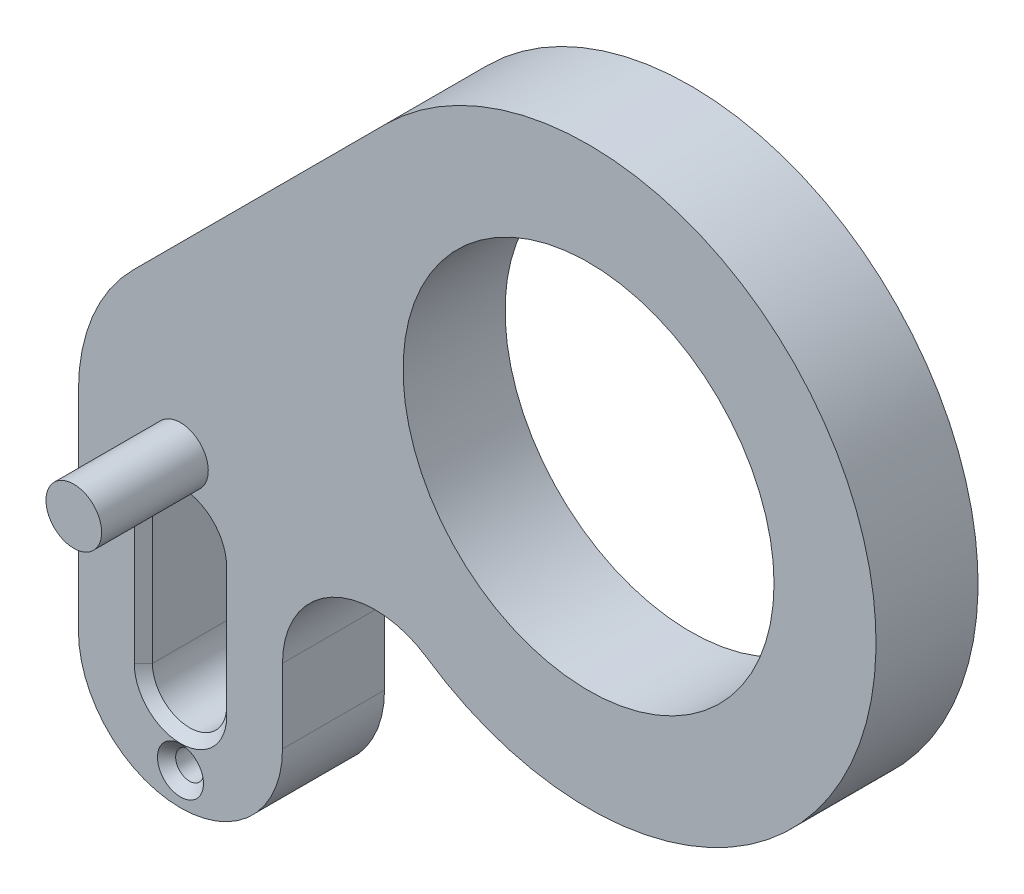
ISO-10303-21;
HEADER;
FILE_DESCRIPTION(('STEP AP214'),'2;1');
FILE_NAME('part.step','',(''),(''),'','','');
FILE_SCHEMA(('AUTOMOTIVE_DESIGN { 1 0 10303 214 1 1 1 1 }'));
ENDSEC;
DATA;
#1=APPLICATION_CONTEXT('core data for automotive mechanical design processes');
#2=APPLICATION_PROTOCOL_DEFINITION('international standard','automotive_design',2000,#1);
#3=PRODUCT_CONTEXT('',#1,'mechanical');
#4=PRODUCT('Part','Part','',(#3));
#5=PRODUCT_RELATED_PRODUCT_CATEGORY('part','',(#4));
#6=PRODUCT_DEFINITION_FORMATION('','',#4);
#7=PRODUCT_DEFINITION_CONTEXT('part definition',#1,'design');
#8=PRODUCT_DEFINITION('design','',#6,#7);
#9=PRODUCT_DEFINITION_SHAPE('','',#8);
#10=(LENGTH_UNIT() NAMED_UNIT(*) SI_UNIT(.MILLI.,.METRE.));
#11=(NAMED_UNIT(*) PLANE_ANGLE_UNIT() SI_UNIT($,.RADIAN.));
#12=(NAMED_UNIT(*) SI_UNIT($,.STERADIAN.) SOLID_ANGLE_UNIT());
#13=UNCERTAINTY_MEASURE_WITH_UNIT(LENGTH_MEASURE(1.E-05),#10,'distance_accuracy_value','');
#14=(GEOMETRIC_REPRESENTATION_CONTEXT(3) GLOBAL_UNCERTAINTY_ASSIGNED_CONTEXT((#13)) GLOBAL_UNIT_ASSIGNED_CONTEXT((#10,
#11,#12)) REPRESENTATION_CONTEXT('',''));
#15=CARTESIAN_POINT('',(0.,0.,0.));
#16=DIRECTION('',(0.,0.,1.));
#17=DIRECTION('',(1.,0.,0.));
#18=AXIS2_PLACEMENT_3D('',#15,#16,#17);
#19=CARTESIAN_POINT('',(10.5,0.499999999999997,2.75));
#20=DIRECTION('',(0.,0.,1.));
#21=DIRECTION('',(1.,0.,0.));
#22=AXIS2_PLACEMENT_3D('',#19,#20,#21);
#23=PLANE('',#22);
#24=CARTESIAN_POINT('',(0.,-7.25,2.75));
#25=DIRECTION('',(0.,0.,1.));
#26=DIRECTION('',(1.,0.,0.));
#27=AXIS2_PLACEMENT_3D('',#24,#25,#26);
#28=CIRCLE('',#27,1.24);
#29=CARTESIAN_POINT('',(1.24,-7.25,2.75));
#30=VERTEX_POINT('',#29);
#31=EDGE_CURVE('E363',#30,#30,#28,.F.);
#32=ORIENTED_EDGE('',*,*,#31,.T.);
#33=EDGE_LOOP('',(#32));
#34=FACE_BOUND('',#33,.T.);
#35=CARTESIAN_POINT('',(0.,3.5,2.75));
#36=DIRECTION('',(0.,0.,1.));
#37=DIRECTION('',(1.,0.,0.));
#38=AXIS2_PLACEMENT_3D('',#35,#36,#37);
#39=CIRCLE('',#38,2.49000000000002);
#40=CARTESIAN_POINT('',(-2.49000000000002,3.5,2.75));
#41=VERTEX_POINT('',#40);
#42=CARTESIAN_POINT('',(0.,5.99000000000002,2.75));
#43=VERTEX_POINT('',#42);
#44=EDGE_CURVE('E349',#41,#43,#39,.F.);
#45=ORIENTED_EDGE('',*,*,#44,.T.);
#46=CARTESIAN_POINT('',(0.,7.49000000000002,2.75));
#47=DIRECTION('',(0.,0.,1.));
#48=DIRECTION('',(1.,0.,0.));
#49=AXIS2_PLACEMENT_3D('',#46,#47,#48);
#50=CIRCLE('',#49,1.5);
#51=EDGE_CURVE('E58',#43,#43,#50,.F.);
#52=ORIENTED_EDGE('',*,*,#51,.T.);
#53=CARTESIAN_POINT('',(2.49000000000002,3.5,2.75));
#54=VERTEX_POINT('',#53);
#55=EDGE_CURVE('E348',#43,#54,#39,.F.);
#56=ORIENTED_EDGE('',*,*,#55,.T.);
#57=DIRECTION('',(0.,-1.,0.));
#58=VECTOR('',#57,1.);
#59=CARTESIAN_POINT('',(2.49000000000002,0.499999999999997,2.75));
#60=LINE('',#59,#58);
#61=CARTESIAN_POINT('',(2.49000000000002,-3.5,2.75));
#62=VERTEX_POINT('',#61);
#63=EDGE_CURVE('E353',#54,#62,#60,.T.);
#64=ORIENTED_EDGE('',*,*,#63,.T.);
#65=CARTESIAN_POINT('',(0.,-3.5,2.75));
#66=DIRECTION('',(0.,0.,1.));
#67=DIRECTION('',(1.,0.,0.));
#68=AXIS2_PLACEMENT_3D('',#65,#66,#67);
#69=CIRCLE('',#68,2.49000000000002);
#70=CARTESIAN_POINT('',(-2.49000000000002,-3.5,2.75));
#71=VERTEX_POINT('',#70);
#72=EDGE_CURVE('E359',#62,#71,#69,.F.);
#73=ORIENTED_EDGE('',*,*,#72,.T.);
#74=DIRECTION('',(0.,1.,0.));
#75=VECTOR('',#74,1.);
#76=CARTESIAN_POINT('',(-2.49000000000002,0.499999999999997,2.75));
#77=LINE('',#76,#75);
#78=EDGE_CURVE('E356',#71,#41,#77,.T.);
#79=ORIENTED_EDGE('',*,*,#78,.T.);
#80=EDGE_LOOP('',(#45,#52,#56,#64,#73,#79));
#81=FACE_BOUND('',#80,.T.);
#82=CARTESIAN_POINT('',(22.,17.4705627484771,2.75));
#83=DIRECTION('',(0.,0.,1.));
#84=DIRECTION('',(1.,0.,0.));
#85=AXIS2_PLACEMENT_3D('',#82,#83,#84);
#86=CIRCLE('',#85,10.);
#87=CARTESIAN_POINT('',(32.,17.4705627484771,2.75));
#88=VERTEX_POINT('',#87);
#89=EDGE_CURVE('E263',#88,#88,#86,.T.);
#90=ORIENTED_EDGE('',*,*,#89,.F.);
#91=EDGE_LOOP('',(#90));
#92=FACE_BOUND('',#91,.T.);
#93=CARTESIAN_POINT('',(10.5,0.499999999999997,2.75));
#94=DIRECTION('',(0.,0.,-1.));
#95=DIRECTION('',(1.,0.,0.));
#96=AXIS2_PLACEMENT_3D('',#93,#94,#95);
#97=CIRCLE('',#96,5.);
#98=CARTESIAN_POINT('',(5.5,0.499999999999997,2.75));
#99=VERTEX_POINT('',#98);
#100=CARTESIAN_POINT('',(13.3048780487805,4.63916164597003,2.75));
#101=VERTEX_POINT('',#100);
#102=EDGE_CURVE('E273',#99,#101,#97,.T.);
#103=ORIENTED_EDGE('',*,*,#102,.T.);
#104=CARTESIAN_POINT('',(22.,17.4705627484771,2.75));
#105=DIRECTION('',(0.,0.,1.));
#106=DIRECTION('',(-1.,0.,0.));
#107=AXIS2_PLACEMENT_3D('',#104,#105,#106);
#108=CIRCLE('',#107,15.5);
#109=CARTESIAN_POINT('',(11.0398448916085,28.4307178568686,2.75));
#110=VERTEX_POINT('',#109);
#111=EDGE_CURVE('E277',#101,#110,#108,.T.);
#112=ORIENTED_EDGE('',*,*,#111,.T.);
#113=DIRECTION('',(-0.707106781186549,-0.707106781186546,0.));
#114=VECTOR('',#113,1.);
#115=CARTESIAN_POINT('',(-2.57106781186546,14.8198051533947,2.75));
#116=LINE('',#115,#114);
#117=CARTESIAN_POINT('',(-2.57106781186546,14.8198051533947,2.75));
#118=VERTEX_POINT('',#117);
#119=EDGE_CURVE('E281',#110,#118,#116,.T.);
#120=ORIENTED_EDGE('',*,*,#119,.T.);
#121=CARTESIAN_POINT('',(4.5,7.74873734152921,2.75));
#122=DIRECTION('',(0.,0.,1.));
#123=DIRECTION('',(1.,0.,0.));
#124=AXIS2_PLACEMENT_3D('',#121,#122,#123);
#125=CIRCLE('',#124,10.);
#126=CARTESIAN_POINT('',(-5.5,7.74873734152921,2.75));
#127=VERTEX_POINT('',#126);
#128=EDGE_CURVE('E284',#118,#127,#125,.T.);
#129=ORIENTED_EDGE('',*,*,#128,.T.);
#130=DIRECTION('',(0.,-1.,0.));
#131=VECTOR('',#130,1.);
#132=CARTESIAN_POINT('',(-5.49999999999999,-3.5,2.75));
#133=LINE('',#132,#131);
#134=CARTESIAN_POINT('',(-5.49999999999999,-3.5,2.75));
#135=VERTEX_POINT('',#134);
#136=EDGE_CURVE('E287',#127,#135,#133,.T.);
#137=ORIENTED_EDGE('',*,*,#136,.T.);
#138=CARTESIAN_POINT('',(0.,-3.5,2.75));
#139=DIRECTION('',(0.,0.,1.));
#140=DIRECTION('',(1.,0.,0.));
#141=AXIS2_PLACEMENT_3D('',#138,#139,#140);
#142=CIRCLE('',#141,5.49999999999999);
#143=CARTESIAN_POINT('',(5.5,-3.5,2.75));
#144=VERTEX_POINT('',#143);
#145=EDGE_CURVE('E290',#135,#144,#142,.T.);
#146=ORIENTED_EDGE('',*,*,#145,.T.);
#147=DIRECTION('',(0.,1.,0.));
#148=VECTOR('',#147,1.);
#149=CARTESIAN_POINT('',(5.49999999999999,-3.5,2.75));
#150=LINE('',#149,#148);
#151=EDGE_CURVE('E293',#144,#99,#150,.T.);
#152=ORIENTED_EDGE('',*,*,#151,.T.);
#153=EDGE_LOOP('',(#103,#112,#120,#129,#137,#146,#152));
#154=FACE_BOUND('',#153,.T.);
#155=ADVANCED_FACE('F41',(#34,#81,#92,#154),#23,.T.);
#156=CARTESIAN_POINT('',(10.5,0.499999999999997,-2.75));
#157=DIRECTION('',(0.,0.,1.));
#158=DIRECTION('',(1.,0.,0.));
#159=AXIS2_PLACEMENT_3D('',#156,#157,#158);
#160=PLANE('',#159);
#161=CARTESIAN_POINT('',(0.,-7.25,-2.75));
#162=DIRECTION('',(0.,0.,1.));
#163=DIRECTION('',(1.,0.,0.));
#164=AXIS2_PLACEMENT_3D('',#161,#162,#163);
#165=CIRCLE('',#164,1.24000000000001);
#166=CARTESIAN_POINT('',(1.24000000000001,-7.25,-2.75));
#167=VERTEX_POINT('',#166);
#168=EDGE_CURVE('E168',#167,#167,#165,.T.);
#169=ORIENTED_EDGE('',*,*,#168,.T.);
#170=EDGE_LOOP('',(#169));
#171=FACE_BOUND('',#170,.T.);
#172=CARTESIAN_POINT('',(0.,3.5,-2.75));
#173=DIRECTION('',(0.,0.,1.));
#174=DIRECTION('',(1.,0.,0.));
#175=AXIS2_PLACEMENT_3D('',#172,#173,#174);
#176=CIRCLE('',#175,2.49000000000001);
#177=CARTESIAN_POINT('',(2.49000000000001,3.5,-2.75));
#178=VERTEX_POINT('',#177);
#179=CARTESIAN_POINT('',(0.,5.99000000000002,-2.75));
#180=VERTEX_POINT('',#179);
#181=EDGE_CURVE('E157',#178,#180,#176,.T.);
#182=ORIENTED_EDGE('',*,*,#181,.T.);
#183=CARTESIAN_POINT('',(0.,7.49000000000002,-2.75));
#184=DIRECTION('',(0.,0.,1.));
#185=DIRECTION('',(1.,0.,0.));
#186=AXIS2_PLACEMENT_3D('',#183,#184,#185);
#187=CIRCLE('',#186,1.5);
#188=EDGE_CURVE('E162',#180,#180,#187,.F.);
#189=ORIENTED_EDGE('',*,*,#188,.F.);
#190=CARTESIAN_POINT('',(-2.49000000000002,3.5,-2.75));
#191=VERTEX_POINT('',#190);
#192=EDGE_CURVE('E169',#180,#191,#176,.T.);
#193=ORIENTED_EDGE('',*,*,#192,.T.);
#194=DIRECTION('',(0.,-1.,0.));
#195=VECTOR('',#194,1.);
#196=CARTESIAN_POINT('',(-2.49000000000002,-3.5,-2.75));
#197=LINE('',#196,#195);
#198=CARTESIAN_POINT('',(-2.49000000000001,-3.5,-2.75));
#199=VERTEX_POINT('',#198);
#200=EDGE_CURVE('E179',#191,#199,#197,.T.);
#201=ORIENTED_EDGE('',*,*,#200,.T.);
#202=CARTESIAN_POINT('',(0.,-3.5,-2.75));
#203=DIRECTION('',(0.,0.,1.));
#204=DIRECTION('',(1.,0.,0.));
#205=AXIS2_PLACEMENT_3D('',#202,#203,#204);
#206=CIRCLE('',#205,2.49000000000001);
#207=CARTESIAN_POINT('',(2.49000000000002,-3.5,-2.75));
#208=VERTEX_POINT('',#207);
#209=EDGE_CURVE('E238',#199,#208,#206,.T.);
#210=ORIENTED_EDGE('',*,*,#209,.T.);
#211=DIRECTION('',(0.,1.,0.));
#212=VECTOR('',#211,1.);
#213=CARTESIAN_POINT('',(2.49000000000001,3.5,-2.75));
#214=LINE('',#213,#212);
#215=EDGE_CURVE('E164',#208,#178,#214,.T.);
#216=ORIENTED_EDGE('',*,*,#215,.T.);
#217=EDGE_LOOP('',(#182,#189,#193,#201,#210,#216));
#218=FACE_BOUND('',#217,.T.);
#219=CARTESIAN_POINT('',(22.,17.4705627484771,-2.75));
#220=DIRECTION('',(0.,0.,1.));
#221=DIRECTION('',(1.,0.,0.));
#222=AXIS2_PLACEMENT_3D('',#219,#220,#221);
#223=CIRCLE('',#222,10.);
#224=CARTESIAN_POINT('',(32.,17.4705627484771,-2.75));
#225=VERTEX_POINT('',#224);
#226=EDGE_CURVE('E258',#225,#225,#223,.T.);
#227=ORIENTED_EDGE('',*,*,#226,.T.);
#228=EDGE_LOOP('',(#227));
#229=FACE_BOUND('',#228,.T.);
#230=CARTESIAN_POINT('',(10.5,0.499999999999997,-2.75));
#231=DIRECTION('',(0.,0.,-1.));
#232=DIRECTION('',(1.,0.,0.));
#233=AXIS2_PLACEMENT_3D('',#230,#231,#232);
#234=CIRCLE('',#233,5.);
#235=CARTESIAN_POINT('',(5.5,0.499999999999997,-2.75));
#236=VERTEX_POINT('',#235);
#237=CARTESIAN_POINT('',(13.3048780487805,4.63916164597003,-2.75));
#238=VERTEX_POINT('',#237);
#239=EDGE_CURVE('E271',#236,#238,#234,.T.);
#240=ORIENTED_EDGE('',*,*,#239,.F.);
#241=DIRECTION('',(0.,1.,0.));
#242=VECTOR('',#241,1.);
#243=CARTESIAN_POINT('',(5.49999999999999,-3.5,-2.75));
#244=LINE('',#243,#242);
#245=CARTESIAN_POINT('',(5.5,-3.5,-2.75));
#246=VERTEX_POINT('',#245);
#247=EDGE_CURVE('E278',#246,#236,#244,.T.);
#248=ORIENTED_EDGE('',*,*,#247,.F.);
#249=CARTESIAN_POINT('',(0.,-3.5,-2.75));
#250=DIRECTION('',(0.,0.,1.));
#251=DIRECTION('',(1.,0.,0.));
#252=AXIS2_PLACEMENT_3D('',#249,#250,#251);
#253=CIRCLE('',#252,5.49999999999999);
#254=CARTESIAN_POINT('',(-5.49999999999999,-3.5,-2.75));
#255=VERTEX_POINT('',#254);
#256=EDGE_CURVE('E312',#255,#246,#253,.T.);
#257=ORIENTED_EDGE('',*,*,#256,.F.);
#258=DIRECTION('',(0.,-1.,0.));
#259=VECTOR('',#258,1.);
#260=CARTESIAN_POINT('',(-5.49999999999999,-3.5,-2.75));
#261=LINE('',#260,#259);
#262=CARTESIAN_POINT('',(-5.5,7.74873734152921,-2.75));
#263=VERTEX_POINT('',#262);
#264=EDGE_CURVE('E309',#263,#255,#261,.T.);
#265=ORIENTED_EDGE('',*,*,#264,.F.);
#266=CARTESIAN_POINT('',(4.5,7.74873734152921,-2.75));
#267=DIRECTION('',(0.,0.,1.));
#268=DIRECTION('',(1.,0.,0.));
#269=AXIS2_PLACEMENT_3D('',#266,#267,#268);
#270=CIRCLE('',#269,10.);
#271=CARTESIAN_POINT('',(-2.57106781186546,14.8198051533947,-2.75));
#272=VERTEX_POINT('',#271);
#273=EDGE_CURVE('E306',#272,#263,#270,.T.);
#274=ORIENTED_EDGE('',*,*,#273,.F.);
#275=DIRECTION('',(-0.707106781186549,-0.707106781186546,0.));
#276=VECTOR('',#275,1.);
#277=CARTESIAN_POINT('',(-2.57106781186546,14.8198051533947,-2.75));
#278=LINE('',#277,#276);
#279=CARTESIAN_POINT('',(11.0398448916085,28.4307178568686,-2.75));
#280=VERTEX_POINT('',#279);
#281=EDGE_CURVE('E303',#280,#272,#278,.T.);
#282=ORIENTED_EDGE('',*,*,#281,.F.);
#283=CARTESIAN_POINT('',(22.,17.4705627484771,-2.75));
#284=DIRECTION('',(0.,0.,1.));
#285=DIRECTION('',(-1.,0.,0.));
#286=AXIS2_PLACEMENT_3D('',#283,#284,#285);
#287=CIRCLE('',#286,15.5);
#288=EDGE_CURVE('E300',#238,#280,#287,.T.);
#289=ORIENTED_EDGE('',*,*,#288,.F.);
#290=EDGE_LOOP('',(#240,#248,#257,#265,#274,#282,#289));
#291=FACE_BOUND('',#290,.T.);
#292=ADVANCED_FACE('F159',(#171,#218,#229,#291),#160,.F.);
#293=CARTESIAN_POINT('',(10.5,0.499999999999997,2.75));
#294=DIRECTION('',(0.,0.,-1.));
#295=DIRECTION('',(-1.,0.,0.));
#296=AXIS2_PLACEMENT_3D('',#293,#294,#295);
#297=CYLINDRICAL_SURFACE('',#296,5.);
#298=ORIENTED_EDGE('',*,*,#239,.T.);
#299=DIRECTION('',(0.,0.,-1.));
#300=VECTOR('',#299,1.);
#301=CARTESIAN_POINT('',(13.3048780487805,4.63916164597003,2.75));
#302=LINE('',#301,#300);
#303=EDGE_CURVE('E340',#101,#238,#302,.T.);
#304=ORIENTED_EDGE('',*,*,#303,.F.);
#305=ORIENTED_EDGE('',*,*,#102,.F.);
#306=DIRECTION('',(0.,0.,-1.));
#307=VECTOR('',#306,1.);
#308=CARTESIAN_POINT('',(5.5,0.499999999999997,2.75));
#309=LINE('',#308,#307);
#310=EDGE_CURVE('E296',#99,#236,#309,.T.);
#311=ORIENTED_EDGE('',*,*,#310,.T.);
#312=EDGE_LOOP('',(#298,#304,#305,#311));
#313=FACE_BOUND('',#312,.T.);
#314=ADVANCED_FACE('F421',(#313),#297,.F.);
#315=CARTESIAN_POINT('',(22.,17.4705627484771,2.75));
#316=DIRECTION('',(0.,0.,-1.));
#317=DIRECTION('',(-1.,0.,0.));
#318=AXIS2_PLACEMENT_3D('',#315,#316,#317);
#319=CYLINDRICAL_SURFACE('',#318,15.5);
#320=ORIENTED_EDGE('',*,*,#288,.T.);
#321=DIRECTION('',(0.,0.,-1.));
#322=VECTOR('',#321,1.);
#323=CARTESIAN_POINT('',(11.0398448916085,28.4307178568686,2.75));
#324=LINE('',#323,#322);
#325=EDGE_CURVE('E336',#110,#280,#324,.T.);
#326=ORIENTED_EDGE('',*,*,#325,.F.);
#327=ORIENTED_EDGE('',*,*,#111,.F.);
#328=ORIENTED_EDGE('',*,*,#303,.T.);
#329=EDGE_LOOP('',(#320,#326,#327,#328));
#330=FACE_BOUND('',#329,.T.);
#331=ADVANCED_FACE('F447',(#330),#319,.T.);
#332=CARTESIAN_POINT('',(-2.57106781186546,14.8198051533947,2.75));
#333=DIRECTION('',(0.707106781186546,-0.707106781186549,0.));
#334=DIRECTION('',(0.707106781186549,0.707106781186546,0.));
#335=AXIS2_PLACEMENT_3D('',#332,#333,#334);
#336=PLANE('',#335);
#337=ORIENTED_EDGE('',*,*,#281,.T.);
#338=DIRECTION('',(0.,0.,-1.));
#339=VECTOR('',#338,1.);
#340=CARTESIAN_POINT('',(-2.57106781186546,14.8198051533947,2.75));
#341=LINE('',#340,#339);
#342=EDGE_CURVE('E332',#118,#272,#341,.T.);
#343=ORIENTED_EDGE('',*,*,#342,.F.);
#344=ORIENTED_EDGE('',*,*,#119,.F.);
#345=ORIENTED_EDGE('',*,*,#325,.T.);
#346=EDGE_LOOP('',(#337,#343,#344,#345));
#347=FACE_BOUND('',#346,.T.);
#348=ADVANCED_FACE('F443',(#347),#336,.F.);
#349=CARTESIAN_POINT('',(4.5,7.74873734152921,2.75));
#350=DIRECTION('',(0.,0.,-1.));
#351=DIRECTION('',(-1.,0.,0.));
#352=AXIS2_PLACEMENT_3D('',#349,#350,#351);
#353=CYLINDRICAL_SURFACE('',#352,10.);
#354=ORIENTED_EDGE('',*,*,#273,.T.);
#355=DIRECTION('',(0.,0.,-1.));
#356=VECTOR('',#355,1.);
#357=CARTESIAN_POINT('',(-5.5,7.74873734152921,2.75));
#358=LINE('',#357,#356);
#359=EDGE_CURVE('E328',#127,#263,#358,.T.);
#360=ORIENTED_EDGE('',*,*,#359,.F.);
#361=ORIENTED_EDGE('',*,*,#128,.F.);
#362=ORIENTED_EDGE('',*,*,#342,.T.);
#363=EDGE_LOOP('',(#354,#360,#361,#362));
#364=FACE_BOUND('',#363,.T.);
#365=ADVANCED_FACE('F439',(#364),#353,.T.);
#366=CARTESIAN_POINT('',(-5.49999999999999,-3.5,2.75));
#367=DIRECTION('',(1.,0.,0.));
#368=DIRECTION('',(0.,1.,0.));
#369=AXIS2_PLACEMENT_3D('',#366,#367,#368);
#370=PLANE('',#369);
#371=ORIENTED_EDGE('',*,*,#264,.T.);
#372=DIRECTION('',(0.,0.,-1.));
#373=VECTOR('',#372,1.);
#374=CARTESIAN_POINT('',(-5.49999999999999,-3.5,2.75));
#375=LINE('',#374,#373);
#376=EDGE_CURVE('E324',#135,#255,#375,.T.);
#377=ORIENTED_EDGE('',*,*,#376,.F.);
#378=ORIENTED_EDGE('',*,*,#136,.F.);
#379=ORIENTED_EDGE('',*,*,#359,.T.);
#380=EDGE_LOOP('',(#371,#377,#378,#379));
#381=FACE_BOUND('',#380,.T.);
#382=ADVANCED_FACE('F435',(#381),#370,.F.);
#383=CARTESIAN_POINT('',(0.,-3.5,2.75));
#384=DIRECTION('',(0.,0.,-1.));
#385=DIRECTION('',(-1.,0.,0.));
#386=AXIS2_PLACEMENT_3D('',#383,#384,#385);
#387=CYLINDRICAL_SURFACE('',#386,5.49999999999999);
#388=ORIENTED_EDGE('',*,*,#256,.T.);
#389=DIRECTION('',(0.,0.,-1.));
#390=VECTOR('',#389,1.);
#391=CARTESIAN_POINT('',(5.5,-3.5,2.75));
#392=LINE('',#391,#390);
#393=EDGE_CURVE('E320',#144,#246,#392,.T.);
#394=ORIENTED_EDGE('',*,*,#393,.F.);
#395=ORIENTED_EDGE('',*,*,#145,.F.);
#396=ORIENTED_EDGE('',*,*,#376,.T.);
#397=EDGE_LOOP('',(#388,#394,#395,#396));
#398=FACE_BOUND('',#397,.T.);
#399=ADVANCED_FACE('F431',(#398),#387,.T.);
#400=CARTESIAN_POINT('',(5.49999999999999,-3.5,2.75));
#401=DIRECTION('',(-1.,0.,0.));
#402=DIRECTION('',(0.,-1.,0.));
#403=AXIS2_PLACEMENT_3D('',#400,#401,#402);
#404=PLANE('',#403);
#405=ORIENTED_EDGE('',*,*,#247,.T.);
#406=ORIENTED_EDGE('',*,*,#310,.F.);
#407=ORIENTED_EDGE('',*,*,#151,.F.);
#408=ORIENTED_EDGE('',*,*,#393,.T.);
#409=EDGE_LOOP('',(#405,#406,#407,#408));
#410=FACE_BOUND('',#409,.T.);
#411=ADVANCED_FACE('F428',(#410),#404,.F.);
#412=CARTESIAN_POINT('',(22.,17.4705627484771,2.75));
#413=DIRECTION('',(0.,0.,-1.));
#414=DIRECTION('',(-1.,0.,0.));
#415=AXIS2_PLACEMENT_3D('',#412,#413,#414);
#416=CYLINDRICAL_SURFACE('',#415,10.);
#417=ORIENTED_EDGE('',*,*,#89,.T.);
#418=EDGE_LOOP('',(#417));
#419=FACE_BOUND('',#418,.T.);
#420=ORIENTED_EDGE('',*,*,#226,.F.);
#421=EDGE_LOOP('',(#420));
#422=FACE_BOUND('',#421,.T.);
#423=ADVANCED_FACE('F425',(#419,#422),#416,.F.);
#424=CARTESIAN_POINT('',(0.,3.5,2.75));
#425=DIRECTION('',(0.,0.,-1.));
#426=DIRECTION('',(-1.,0.,0.));
#427=AXIS2_PLACEMENT_3D('',#424,#425,#426);
#428=CYLINDRICAL_SURFACE('',#427,2.00000000000002);
#429=DIRECTION('',(0.,0.,-1.));
#430=VECTOR('',#429,1.);
#431=CARTESIAN_POINT('',(-2.00000000000002,3.5,2.75));
#432=LINE('',#431,#430);
#433=CARTESIAN_POINT('',(-2.00000000000002,3.5,2.26));
#434=VERTEX_POINT('',#433);
#435=CARTESIAN_POINT('',(-2.00000000000002,3.5,-2.26));
#436=VERTEX_POINT('',#435);
#437=EDGE_CURVE('E252',#434,#436,#432,.T.);
#438=ORIENTED_EDGE('',*,*,#437,.T.);
#439=CARTESIAN_POINT('',(0.,3.5,-2.26));
#440=DIRECTION('',(0.,0.,1.));
#441=DIRECTION('',(1.,0.,0.));
#442=AXIS2_PLACEMENT_3D('',#439,#440,#441);
#443=CIRCLE('',#442,2.00000000000002);
#444=CARTESIAN_POINT('',(2.00000000000001,3.5,-2.26));
#445=VERTEX_POINT('',#444);
#446=EDGE_CURVE('E190',#436,#445,#443,.F.);
#447=ORIENTED_EDGE('',*,*,#446,.T.);
#448=DIRECTION('',(0.,0.,-1.));
#449=VECTOR('',#448,1.);
#450=CARTESIAN_POINT('',(2.00000000000001,3.5,2.75));
#451=LINE('',#450,#449);
#452=CARTESIAN_POINT('',(2.00000000000001,3.5,2.26));
#453=VERTEX_POINT('',#452);
#454=EDGE_CURVE('E237',#453,#445,#451,.T.);
#455=ORIENTED_EDGE('',*,*,#454,.F.);
#456=CARTESIAN_POINT('',(0.,3.5,2.26));
#457=DIRECTION('',(0.,0.,1.));
#458=DIRECTION('',(1.,0.,0.));
#459=AXIS2_PLACEMENT_3D('',#456,#457,#458);
#460=CIRCLE('',#459,2.00000000000002);
#461=EDGE_CURVE('E227',#453,#434,#460,.T.);
#462=ORIENTED_EDGE('',*,*,#461,.T.);
#463=EDGE_LOOP('',(#438,#447,#455,#462));
#464=FACE_BOUND('',#463,.T.);
#465=ADVANCED_FACE('F255',(#464),#428,.F.);
#466=CARTESIAN_POINT('',(-2.00000000000002,3.5,2.75));
#467=DIRECTION('',(1.,0.,0.));
#468=DIRECTION('',(0.,0.,-1.));
#469=AXIS2_PLACEMENT_3D('',#466,#467,#468);
#470=PLANE('',#469);
#471=DIRECTION('',(0.,0.,-1.));
#472=VECTOR('',#471,1.);
#473=CARTESIAN_POINT('',(-2.00000000000001,-3.5,2.75));
#474=LINE('',#473,#472);
#475=CARTESIAN_POINT('',(-2.00000000000001,-3.5,2.26));
#476=VERTEX_POINT('',#475);
#477=CARTESIAN_POINT('',(-2.00000000000001,-3.5,-2.26));
#478=VERTEX_POINT('',#477);
#479=EDGE_CURVE('E254',#476,#478,#474,.T.);
#480=ORIENTED_EDGE('',*,*,#479,.T.);
#481=DIRECTION('',(0.,1.,0.));
#482=VECTOR('',#481,1.);
#483=CARTESIAN_POINT('',(-2.00000000000002,3.5,-2.26));
#484=LINE('',#483,#482);
#485=EDGE_CURVE('E52',#478,#436,#484,.T.);
#486=ORIENTED_EDGE('',*,*,#485,.T.);
#487=ORIENTED_EDGE('',*,*,#437,.F.);
#488=DIRECTION('',(0.,-1.,0.));
#489=VECTOR('',#488,1.);
#490=CARTESIAN_POINT('',(-2.00000000000002,3.5,2.26));
#491=LINE('',#490,#489);
#492=EDGE_CURVE('E371',#434,#476,#491,.T.);
#493=ORIENTED_EDGE('',*,*,#492,.T.);
#494=EDGE_LOOP('',(#480,#486,#487,#493));
#495=FACE_BOUND('',#494,.T.);
#496=ADVANCED_FACE('F251',(#495),#470,.T.);
#497=CARTESIAN_POINT('',(0.,-3.5,2.75));
#498=DIRECTION('',(0.,0.,-1.));
#499=DIRECTION('',(-1.,0.,0.));
#500=AXIS2_PLACEMENT_3D('',#497,#498,#499);
#501=CYLINDRICAL_SURFACE('',#500,2.00000000000002);
#502=DIRECTION('',(0.,0.,-1.));
#503=VECTOR('',#502,1.);
#504=CARTESIAN_POINT('',(2.00000000000001,-3.5,2.75));
#505=LINE('',#504,#503);
#506=CARTESIAN_POINT('',(2.00000000000001,-3.5,2.26));
#507=VERTEX_POINT('',#506);
#508=CARTESIAN_POINT('',(2.00000000000001,-3.5,-2.26));
#509=VERTEX_POINT('',#508);
#510=EDGE_CURVE('E265',#507,#509,#505,.T.);
#511=ORIENTED_EDGE('',*,*,#510,.T.);
#512=CARTESIAN_POINT('',(0.,-3.5,-2.26));
#513=DIRECTION('',(0.,0.,1.));
#514=DIRECTION('',(1.,0.,0.));
#515=AXIS2_PLACEMENT_3D('',#512,#513,#514);
#516=CIRCLE('',#515,2.00000000000002);
#517=EDGE_CURVE('E11',#509,#478,#516,.F.);
#518=ORIENTED_EDGE('',*,*,#517,.T.);
#519=ORIENTED_EDGE('',*,*,#479,.F.);
#520=CARTESIAN_POINT('',(0.,-3.5,2.26));
#521=DIRECTION('',(0.,0.,1.));
#522=DIRECTION('',(1.,0.,0.));
#523=AXIS2_PLACEMENT_3D('',#520,#521,#522);
#524=CIRCLE('',#523,2.00000000000002);
#525=EDGE_CURVE('E367',#476,#507,#524,.T.);
#526=ORIENTED_EDGE('',*,*,#525,.T.);
#527=EDGE_LOOP('',(#511,#518,#519,#526));
#528=FACE_BOUND('',#527,.T.);
#529=ADVANCED_FACE('F405',(#528),#501,.F.);
#530=CARTESIAN_POINT('',(2.00000000000001,3.5,2.75));
#531=DIRECTION('',(-1.,0.,0.));
#532=DIRECTION('',(0.,0.,1.));
#533=AXIS2_PLACEMENT_3D('',#530,#531,#532);
#534=PLANE('',#533);
#535=ORIENTED_EDGE('',*,*,#454,.T.);
#536=DIRECTION('',(0.,-1.,0.));
#537=VECTOR('',#536,1.);
#538=CARTESIAN_POINT('',(2.00000000000001,-3.5,-2.26));
#539=LINE('',#538,#537);
#540=EDGE_CURVE('E194',#445,#509,#539,.T.);
#541=ORIENTED_EDGE('',*,*,#540,.T.);
#542=ORIENTED_EDGE('',*,*,#510,.F.);
#543=DIRECTION('',(0.,1.,0.));
#544=VECTOR('',#543,1.);
#545=CARTESIAN_POINT('',(2.00000000000001,3.5,2.26));
#546=LINE('',#545,#544);
#547=EDGE_CURVE('E373',#507,#453,#546,.T.);
#548=ORIENTED_EDGE('',*,*,#547,.T.);
#549=EDGE_LOOP('',(#535,#541,#542,#548));
#550=FACE_BOUND('',#549,.T.);
#551=ADVANCED_FACE('F378',(#550),#534,.T.);
#552=CARTESIAN_POINT('',(0.,-7.25,2.75));
#553=DIRECTION('',(0.,0.,-1.));
#554=DIRECTION('',(-1.,0.,0.));
#555=AXIS2_PLACEMENT_3D('',#552,#553,#554);
#556=CYLINDRICAL_SURFACE('',#555,0.750000000000002);
#557=CARTESIAN_POINT('',(0.,-7.25,-2.25999999999999));
#558=DIRECTION('',(0.,0.,1.));
#559=DIRECTION('',(1.,0.,0.));
#560=AXIS2_PLACEMENT_3D('',#557,#558,#559);
#561=CIRCLE('',#560,0.750000000000002);
#562=CARTESIAN_POINT('',(0.750000000000006,-7.25,-2.25999999999999));
#563=VERTEX_POINT('',#562);
#564=EDGE_CURVE('E186',#563,#563,#561,.F.);
#565=ORIENTED_EDGE('',*,*,#564,.T.);
#566=EDGE_LOOP('',(#565));
#567=FACE_BOUND('',#566,.T.);
#568=CARTESIAN_POINT('',(0.,-7.25,2.26));
#569=DIRECTION('',(0.,0.,1.));
#570=DIRECTION('',(1.,0.,0.));
#571=AXIS2_PLACEMENT_3D('',#568,#569,#570);
#572=CIRCLE('',#571,0.750000000000002);
#573=CARTESIAN_POINT('',(0.750000000000006,-7.25,2.26));
#574=VERTEX_POINT('',#573);
#575=EDGE_CURVE('E344',#574,#574,#572,.T.);
#576=ORIENTED_EDGE('',*,*,#575,.T.);
#577=EDGE_LOOP('',(#576));
#578=FACE_BOUND('',#577,.T.);
#579=ADVANCED_FACE('F412',(#567,#578),#556,.F.);
#580=CARTESIAN_POINT('',(0.,-7.25,2.26));
#581=DIRECTION('',(0.,0.,1.));
#582=DIRECTION('',(1.,0.,0.));
#583=AXIS2_PLACEMENT_3D('',#580,#581,#582);
#584=CONICAL_SURFACE('',#583,0.750000000000002,0.785398163397445);
#585=ORIENTED_EDGE('',*,*,#31,.F.);
#586=EDGE_LOOP('',(#585));
#587=FACE_BOUND('',#586,.T.);
#588=ORIENTED_EDGE('',*,*,#575,.F.);
#589=EDGE_LOOP('',(#588));
#590=FACE_BOUND('',#589,.T.);
#591=ADVANCED_FACE('F456',(#587,#590),#584,.F.);
#592=CARTESIAN_POINT('',(0.,3.5,2.26));
#593=DIRECTION('',(0.,0.,1.));
#594=DIRECTION('',(1.,0.,0.));
#595=AXIS2_PLACEMENT_3D('',#592,#593,#594);
#596=CONICAL_SURFACE('',#595,2.00000000000002,0.785398163397454);
#597=DIRECTION('',(-0.707106781186552,0.,-0.707106781186543));
#598=VECTOR('',#597,1.);
#599=CARTESIAN_POINT('',(2.49000000000002,3.5,2.75));
#600=LINE('',#599,#598);
#601=EDGE_CURVE('E224',#54,#453,#600,.T.);
#602=ORIENTED_EDGE('',*,*,#601,.F.);
#603=ORIENTED_EDGE('',*,*,#55,.F.);
#604=ORIENTED_EDGE('',*,*,#44,.F.);
#605=DIRECTION('',(-0.707106781186552,0.,0.707106781186543));
#606=VECTOR('',#605,1.);
#607=CARTESIAN_POINT('',(-2.00000000000002,3.5,2.26));
#608=LINE('',#607,#606);
#609=EDGE_CURVE('E233',#434,#41,#608,.T.);
#610=ORIENTED_EDGE('',*,*,#609,.F.);
#611=ORIENTED_EDGE('',*,*,#461,.F.);
#612=EDGE_LOOP('',(#602,#603,#604,#610,#611));
#613=FACE_BOUND('',#612,.T.);
#614=ADVANCED_FACE('F384',(#613),#596,.F.);
#615=CARTESIAN_POINT('',(-2.00000000000002,3.5,2.26));
#616=DIRECTION('',(-0.707106781186543,0.,-0.707106781186552));
#617=DIRECTION('',(0.,-1.,0.));
#618=AXIS2_PLACEMENT_3D('',#615,#616,#617);
#619=PLANE('',#618);
#620=ORIENTED_EDGE('',*,*,#609,.T.);
#621=ORIENTED_EDGE('',*,*,#78,.F.);
#622=DIRECTION('',(-0.707106781186552,0.,0.707106781186543));
#623=VECTOR('',#622,1.);
#624=CARTESIAN_POINT('',(-2.00000000000002,-3.5,2.26));
#625=LINE('',#624,#623);
#626=EDGE_CURVE('E216',#476,#71,#625,.T.);
#627=ORIENTED_EDGE('',*,*,#626,.F.);
#628=ORIENTED_EDGE('',*,*,#492,.F.);
#629=EDGE_LOOP('',(#620,#621,#627,#628));
#630=FACE_BOUND('',#629,.T.);
#631=ADVANCED_FACE('F396',(#630),#619,.F.);
#632=CARTESIAN_POINT('',(2.00000000000001,3.5,2.26));
#633=DIRECTION('',(0.707106781186543,0.,-0.707106781186552));
#634=DIRECTION('',(0.,1.,0.));
#635=AXIS2_PLACEMENT_3D('',#632,#633,#634);
#636=PLANE('',#635);
#637=ORIENTED_EDGE('',*,*,#601,.T.);
#638=ORIENTED_EDGE('',*,*,#547,.F.);
#639=DIRECTION('',(-0.707106781186552,0.,-0.707106781186543));
#640=VECTOR('',#639,1.);
#641=CARTESIAN_POINT('',(2.49000000000002,-3.5,2.75));
#642=LINE('',#641,#640);
#643=EDGE_CURVE('E211',#62,#507,#642,.T.);
#644=ORIENTED_EDGE('',*,*,#643,.F.);
#645=ORIENTED_EDGE('',*,*,#63,.F.);
#646=EDGE_LOOP('',(#637,#638,#644,#645));
#647=FACE_BOUND('',#646,.T.);
#648=ADVANCED_FACE('F389',(#647),#636,.F.);
#649=CARTESIAN_POINT('',(0.,-3.5,2.26));
#650=DIRECTION('',(0.,0.,1.));
#651=DIRECTION('',(1.,0.,0.));
#652=AXIS2_PLACEMENT_3D('',#649,#650,#651);
#653=CONICAL_SURFACE('',#652,2.00000000000002,0.785398163397454);
#654=ORIENTED_EDGE('',*,*,#626,.T.);
#655=ORIENTED_EDGE('',*,*,#72,.F.);
#656=ORIENTED_EDGE('',*,*,#643,.T.);
#657=ORIENTED_EDGE('',*,*,#525,.F.);
#658=EDGE_LOOP('',(#654,#655,#656,#657));
#659=FACE_BOUND('',#658,.T.);
#660=ADVANCED_FACE('F392',(#659),#653,.F.);
#661=CARTESIAN_POINT('',(0.,-7.25,-2.75));
#662=DIRECTION('',(0.,0.,-1.));
#663=DIRECTION('',(-1.,0.,0.));
#664=AXIS2_PLACEMENT_3D('',#661,#662,#663);
#665=CONICAL_SURFACE('',#664,1.24000000000001,0.785398163397444);
#666=ORIENTED_EDGE('',*,*,#564,.F.);
#667=EDGE_LOOP('',(#666));
#668=FACE_BOUND('',#667,.T.);
#669=ORIENTED_EDGE('',*,*,#168,.F.);
#670=EDGE_LOOP('',(#669));
#671=FACE_BOUND('',#670,.T.);
#672=ADVANCED_FACE('F470',(#668,#671),#665,.F.);
#673=CARTESIAN_POINT('',(0.,-3.5,-2.75));
#674=DIRECTION('',(0.,0.,-1.));
#675=DIRECTION('',(-1.,0.,0.));
#676=AXIS2_PLACEMENT_3D('',#673,#674,#675);
#677=CONICAL_SURFACE('',#676,2.49000000000001,0.785398163397448);
#678=DIRECTION('',(-0.707106781186548,0.,-0.707106781186548));
#679=VECTOR('',#678,1.);
#680=CARTESIAN_POINT('',(-2.00000000000001,-3.5,-2.26));
#681=LINE('',#680,#679);
#682=EDGE_CURVE('E203',#478,#199,#681,.T.);
#683=ORIENTED_EDGE('',*,*,#682,.F.);
#684=ORIENTED_EDGE('',*,*,#517,.F.);
#685=DIRECTION('',(-0.707106781186548,0.,0.707106781186548));
#686=VECTOR('',#685,1.);
#687=CARTESIAN_POINT('',(2.49000000000002,-3.5,-2.75));
#688=LINE('',#687,#686);
#689=EDGE_CURVE('E46',#208,#509,#688,.T.);
#690=ORIENTED_EDGE('',*,*,#689,.F.);
#691=ORIENTED_EDGE('',*,*,#209,.F.);
#692=EDGE_LOOP('',(#683,#684,#690,#691));
#693=FACE_BOUND('',#692,.T.);
#694=ADVANCED_FACE('F44',(#693),#677,.F.);
#695=CARTESIAN_POINT('',(2.49000000000001,0.499999999999997,-2.75));
#696=DIRECTION('',(-0.707106781186548,0.,-0.707106781186548));
#697=DIRECTION('',(0.,-1.,0.));
#698=AXIS2_PLACEMENT_3D('',#695,#696,#697);
#699=PLANE('',#698);
#700=ORIENTED_EDGE('',*,*,#689,.T.);
#701=ORIENTED_EDGE('',*,*,#540,.F.);
#702=DIRECTION('',(-0.707106781186548,0.,0.707106781186548));
#703=VECTOR('',#702,1.);
#704=CARTESIAN_POINT('',(2.49000000000001,3.5,-2.75));
#705=LINE('',#704,#703);
#706=EDGE_CURVE('E201',#178,#445,#705,.T.);
#707=ORIENTED_EDGE('',*,*,#706,.F.);
#708=ORIENTED_EDGE('',*,*,#215,.F.);
#709=EDGE_LOOP('',(#700,#701,#707,#708));
#710=FACE_BOUND('',#709,.T.);
#711=ADVANCED_FACE('F243',(#710),#699,.T.);
#712=CARTESIAN_POINT('',(-2.49000000000002,0.499999999999997,-2.75));
#713=DIRECTION('',(0.707106781186548,0.,-0.707106781186548));
#714=DIRECTION('',(0.,1.,0.));
#715=AXIS2_PLACEMENT_3D('',#712,#713,#714);
#716=PLANE('',#715);
#717=ORIENTED_EDGE('',*,*,#682,.T.);
#718=ORIENTED_EDGE('',*,*,#200,.F.);
#719=DIRECTION('',(-0.707106781186548,0.,-0.707106781186548));
#720=VECTOR('',#719,1.);
#721=CARTESIAN_POINT('',(-2.00000000000002,3.5,-2.26));
#722=LINE('',#721,#720);
#723=EDGE_CURVE('E175',#436,#191,#722,.T.);
#724=ORIENTED_EDGE('',*,*,#723,.F.);
#725=ORIENTED_EDGE('',*,*,#485,.F.);
#726=EDGE_LOOP('',(#717,#718,#724,#725));
#727=FACE_BOUND('',#726,.T.);
#728=ADVANCED_FACE('F248',(#727),#716,.T.);
#729=CARTESIAN_POINT('',(0.,3.5,-2.75));
#730=DIRECTION('',(0.,0.,-1.));
#731=DIRECTION('',(-1.,0.,0.));
#732=AXIS2_PLACEMENT_3D('',#729,#730,#731);
#733=CONICAL_SURFACE('',#732,2.49000000000001,0.785398163397448);
#734=ORIENTED_EDGE('',*,*,#706,.T.);
#735=ORIENTED_EDGE('',*,*,#446,.F.);
#736=ORIENTED_EDGE('',*,*,#723,.T.);
#737=ORIENTED_EDGE('',*,*,#192,.F.);
#738=ORIENTED_EDGE('',*,*,#181,.F.);
#739=EDGE_LOOP('',(#734,#735,#736,#737,#738));
#740=FACE_BOUND('',#739,.T.);
#741=ADVANCED_FACE('F172',(#740),#733,.F.);
#742=CARTESIAN_POINT('',(0.,7.49000000000002,-8.5));
#743=DIRECTION('',(0.,0.,1.));
#744=DIRECTION('',(1.,0.,0.));
#745=AXIS2_PLACEMENT_3D('',#742,#743,#744);
#746=PLANE('',#745);
#747=CARTESIAN_POINT('',(0.,7.49000000000002,-8.5));
#748=DIRECTION('',(0.,0.,1.));
#749=DIRECTION('',(1.,0.,0.));
#750=AXIS2_PLACEMENT_3D('',#747,#748,#749);
#751=CIRCLE('',#750,1.5);
#752=CARTESIAN_POINT('',(1.5,7.49000000000002,-8.5));
#753=VERTEX_POINT('',#752);
#754=EDGE_CURVE('E681',#753,#753,#751,.T.);
#755=ORIENTED_EDGE('',*,*,#754,.F.);
#756=EDGE_LOOP('',(#755));
#757=FACE_BOUND('',#756,.T.);
#758=ADVANCED_FACE('F495',(#757),#746,.F.);
#759=CARTESIAN_POINT('',(0.,7.49000000000002,8.5));
#760=DIRECTION('',(0.,0.,-1.));
#761=DIRECTION('',(-1.,0.,0.));
#762=AXIS2_PLACEMENT_3D('',#759,#760,#761);
#763=CYLINDRICAL_SURFACE('',#762,1.5);
#764=ORIENTED_EDGE('',*,*,#754,.T.);
#765=EDGE_LOOP('',(#764));
#766=FACE_BOUND('',#765,.T.);
#767=ORIENTED_EDGE('',*,*,#188,.T.);
#768=EDGE_LOOP('',(#767));
#769=FACE_BOUND('',#768,.T.);
#770=ADVANCED_FACE('F642',(#766,#769),#763,.T.);
#771=ORIENTED_EDGE('',*,*,#51,.F.);
#772=EDGE_LOOP('',(#771));
#773=FACE_BOUND('',#772,.T.);
#774=CARTESIAN_POINT('',(0.,7.49000000000002,8.5));
#775=DIRECTION('',(0.,0.,1.));
#776=DIRECTION('',(1.,0.,0.));
#777=AXIS2_PLACEMENT_3D('',#774,#775,#776);
#778=CIRCLE('',#777,1.5);
#779=CARTESIAN_POINT('',(1.5,7.49000000000002,8.5));
#780=VERTEX_POINT('',#779);
#781=EDGE_CURVE('E401',#780,#780,#778,.T.);
#782=ORIENTED_EDGE('',*,*,#781,.F.);
#783=EDGE_LOOP('',(#782));
#784=FACE_BOUND('',#783,.T.);
#785=ADVANCED_FACE('F650',(#773,#784),#763,.T.);
#786=CARTESIAN_POINT('',(0.,7.49000000000002,8.5));
#787=DIRECTION('',(0.,0.,1.));
#788=DIRECTION('',(1.,0.,0.));
#789=AXIS2_PLACEMENT_3D('',#786,#787,#788);
#790=PLANE('',#789);
#791=ORIENTED_EDGE('',*,*,#781,.T.);
#792=EDGE_LOOP('',(#791));
#793=FACE_BOUND('',#792,.T.);
#794=ADVANCED_FACE('F658',(#793),#790,.T.);
#795=CLOSED_SHELL('',(#155,#292,#314,#331,#348,#365,#382,#399,#411,#423,#465,#496,#529,#551,
#579,#591,#614,#631,#648,#660,#672,#694,#711,#728,#741,#758,#770,#785,#794));
#796=MANIFOLD_SOLID_BREP('B2',#795);
#797=ADVANCED_BREP_SHAPE_REPRESENTATION('',(#18,#796),#14);
#798=SHAPE_DEFINITION_REPRESENTATION(#9,#797);
ENDSEC;
END-ISO-10303-21;
